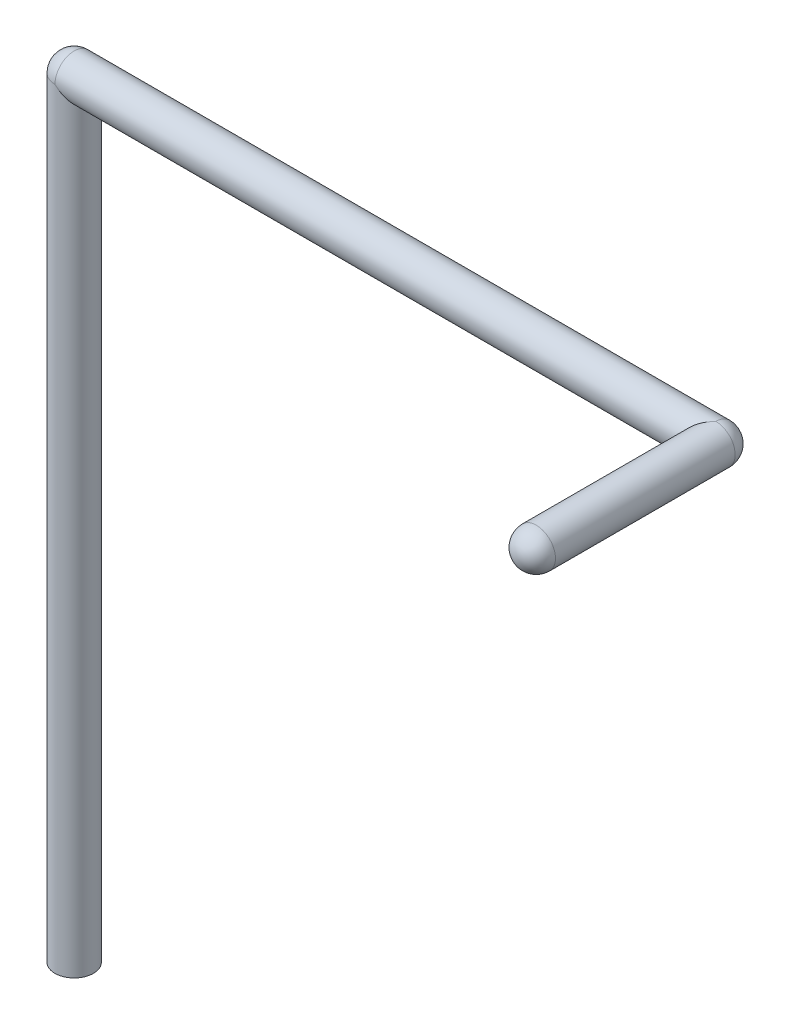
ISO-10303-21;
HEADER;
FILE_DESCRIPTION(('STEP AP214'),'2;1');
FILE_NAME('part.step','',(''),(''),'','','');
FILE_SCHEMA(('AUTOMOTIVE_DESIGN { 1 0 10303 214 1 1 1 1 }'));
ENDSEC;
DATA;
#1=APPLICATION_CONTEXT('core data for automotive mechanical design processes');
#2=APPLICATION_PROTOCOL_DEFINITION('international standard','automotive_design',2000,#1);
#3=PRODUCT_CONTEXT('',#1,'mechanical');
#4=PRODUCT('Part','Part','',(#3));
#5=PRODUCT_RELATED_PRODUCT_CATEGORY('part','',(#4));
#6=PRODUCT_DEFINITION_FORMATION('','',#4);
#7=PRODUCT_DEFINITION_CONTEXT('part definition',#1,'design');
#8=PRODUCT_DEFINITION('design','',#6,#7);
#9=PRODUCT_DEFINITION_SHAPE('','',#8);
#10=(LENGTH_UNIT() NAMED_UNIT(*) SI_UNIT(.MILLI.,.METRE.));
#11=(NAMED_UNIT(*) PLANE_ANGLE_UNIT() SI_UNIT($,.RADIAN.));
#12=(NAMED_UNIT(*) SI_UNIT($,.STERADIAN.) SOLID_ANGLE_UNIT());
#13=UNCERTAINTY_MEASURE_WITH_UNIT(LENGTH_MEASURE(1.E-05),#10,'distance_accuracy_value','');
#14=(GEOMETRIC_REPRESENTATION_CONTEXT(3) GLOBAL_UNCERTAINTY_ASSIGNED_CONTEXT((#13)) GLOBAL_UNIT_ASSIGNED_CONTEXT((#10,
#11,#12)) REPRESENTATION_CONTEXT('',''));
#15=CARTESIAN_POINT('',(0.,0.,0.));
#16=DIRECTION('',(0.,0.,1.));
#17=DIRECTION('',(1.,0.,0.));
#18=AXIS2_PLACEMENT_3D('',#15,#16,#17);
#19=CARTESIAN_POINT('',(25.,30.,0.));
#20=DIRECTION('',(-1.,0.,0.));
#21=DIRECTION('',(0.,0.,1.));
#22=AXIS2_PLACEMENT_3D('',#19,#20,#21);
#23=CYLINDRICAL_SURFACE('',#22,0.75);
#24=CARTESIAN_POINT('',(0.,30.,0.));
#25=DIRECTION('',(1.,0.,0.));
#26=DIRECTION('',(0.,0.,-1.));
#27=AXIS2_PLACEMENT_3D('',#24,#25,#26);
#28=CIRCLE('',#27,0.75);
#29=CARTESIAN_POINT('',(0.,30.,-0.75));
#30=VERTEX_POINT('',#29);
#31=CARTESIAN_POINT('',(0.,30.,0.75));
#32=VERTEX_POINT('',#31);
#33=EDGE_CURVE('E53',#30,#32,#28,.T.);
#34=ORIENTED_EDGE('',*,*,#33,.T.);
#35=CARTESIAN_POINT('',(0.,30.,0.));
#36=DIRECTION('',(-0.707106781186547,-0.707106781186547,0.));
#37=DIRECTION('',(0.707106781186547,-0.707106781186547,0.));
#38=AXIS2_PLACEMENT_3D('',#35,#36,#37);
#39=ELLIPSE('',#38,1.06066017177982,0.75);
#40=EDGE_CURVE('E63',#32,#30,#39,.F.);
#41=ORIENTED_EDGE('',*,*,#40,.T.);
#42=EDGE_LOOP('',(#34,#41));
#43=FACE_BOUND('',#42,.T.);
#44=CARTESIAN_POINT('',(25.,30.,0.));
#45=DIRECTION('',(-0.707106781186547,0.,-0.707106781186547));
#46=DIRECTION('',(-0.707106781186547,0.,0.707106781186547));
#47=AXIS2_PLACEMENT_3D('',#44,#45,#46);
#48=ELLIPSE('',#47,1.06066017177982,0.750000000000001);
#49=CARTESIAN_POINT('',(25.,30.75,0.));
#50=VERTEX_POINT('',#49);
#51=CARTESIAN_POINT('',(25.,29.25,0.));
#52=VERTEX_POINT('',#51);
#53=EDGE_CURVE('E65',#50,#52,#48,.F.);
#54=ORIENTED_EDGE('',*,*,#53,.F.);
#55=CARTESIAN_POINT('',(25.,30.,0.));
#56=DIRECTION('',(1.,0.,0.));
#57=DIRECTION('',(0.,0.,-1.));
#58=AXIS2_PLACEMENT_3D('',#55,#56,#57);
#59=CIRCLE('',#58,0.75);
#60=EDGE_CURVE('E58',#52,#50,#59,.T.);
#61=ORIENTED_EDGE('',*,*,#60,.F.);
#62=EDGE_LOOP('',(#54,#61));
#63=FACE_BOUND('',#62,.T.);
#64=ADVANCED_FACE('F34',(#43,#63),#23,.T.);
#65=CARTESIAN_POINT('',(25.,30.,0.));
#66=DIRECTION('',(-1.,0.,0.));
#67=DIRECTION('',(0.,1.,0.));
#68=AXIS2_PLACEMENT_3D('',#65,#66,#67);
#69=SPHERICAL_SURFACE('',#68,0.750000000000001);
#70=CARTESIAN_POINT('',(25.,30.,0.));
#71=DIRECTION('',(0.,0.,1.));
#72=DIRECTION('',(1.,0.,0.));
#73=AXIS2_PLACEMENT_3D('',#70,#71,#72);
#74=CIRCLE('',#73,0.750000000000001);
#75=EDGE_CURVE('E11',#52,#50,#74,.T.);
#76=ORIENTED_EDGE('',*,*,#75,.F.);
#77=ORIENTED_EDGE('',*,*,#60,.T.);
#78=EDGE_LOOP('',(#76,#77));
#79=FACE_BOUND('',#78,.T.);
#80=ADVANCED_FACE('F60',(#79),#69,.T.);
#81=CARTESIAN_POINT('',(0.,30.,0.));
#82=DIRECTION('',(0.,-1.,0.));
#83=DIRECTION('',(0.,0.,-1.));
#84=AXIS2_PLACEMENT_3D('',#81,#82,#83);
#85=CYLINDRICAL_SURFACE('',#84,0.75);
#86=CARTESIAN_POINT('',(0.,0.,0.));
#87=DIRECTION('',(0.,1.,0.));
#88=DIRECTION('',(0.,0.,1.));
#89=AXIS2_PLACEMENT_3D('',#86,#87,#88);
#90=CIRCLE('',#89,0.75);
#91=CARTESIAN_POINT('',(0.,0.,0.75));
#92=VERTEX_POINT('',#91);
#93=EDGE_CURVE('E102',#92,#92,#90,.T.);
#94=ORIENTED_EDGE('',*,*,#93,.T.);
#95=EDGE_LOOP('',(#94));
#96=FACE_BOUND('',#95,.T.);
#97=ORIENTED_EDGE('',*,*,#40,.F.);
#98=CARTESIAN_POINT('',(0.,30.,0.));
#99=DIRECTION('',(0.,1.,0.));
#100=DIRECTION('',(0.,0.,1.));
#101=AXIS2_PLACEMENT_3D('',#98,#99,#100);
#102=CIRCLE('',#101,0.75);
#103=EDGE_CURVE('E42',#30,#32,#102,.T.);
#104=ORIENTED_EDGE('',*,*,#103,.F.);
#105=EDGE_LOOP('',(#97,#104));
#106=FACE_BOUND('',#105,.T.);
#107=ADVANCED_FACE('F36',(#96,#106),#85,.T.);
#108=CARTESIAN_POINT('',(0.,30.,0.));
#109=DIRECTION('',(0.,1.,0.));
#110=DIRECTION('',(0.,0.,-1.));
#111=AXIS2_PLACEMENT_3D('',#108,#109,#110);
#112=SPHERICAL_SURFACE('',#111,0.750000000000001);
#113=ORIENTED_EDGE('',*,*,#33,.F.);
#114=ORIENTED_EDGE('',*,*,#103,.T.);
#115=EDGE_LOOP('',(#113,#114));
#116=FACE_BOUND('',#115,.T.);
#117=ADVANCED_FACE('F81',(#116),#112,.T.);
#118=CARTESIAN_POINT('',(0.,0.,0.));
#119=DIRECTION('',(0.,1.,0.));
#120=DIRECTION('',(0.,0.,1.));
#121=AXIS2_PLACEMENT_3D('',#118,#119,#120);
#122=PLANE('',#121);
#123=ORIENTED_EDGE('',*,*,#93,.F.);
#124=EDGE_LOOP('',(#123));
#125=FACE_BOUND('',#124,.T.);
#126=ADVANCED_FACE('F72',(#125),#122,.F.);
#127=CARTESIAN_POINT('',(25.,30.,7.));
#128=DIRECTION('',(0.,0.,-1.));
#129=DIRECTION('',(-1.,0.,0.));
#130=AXIS2_PLACEMENT_3D('',#127,#128,#129);
#131=CYLINDRICAL_SURFACE('',#130,0.750000000000002);
#132=CARTESIAN_POINT('',(25.,30.,7.));
#133=DIRECTION('',(0.,0.,1.));
#134=DIRECTION('',(1.,0.,0.));
#135=AXIS2_PLACEMENT_3D('',#132,#133,#134);
#136=CIRCLE('',#135,0.750000000000002);
#137=CARTESIAN_POINT('',(25.75,30.,7.));
#138=VERTEX_POINT('',#137);
#139=EDGE_CURVE('E67',#138,#138,#136,.T.);
#140=ORIENTED_EDGE('',*,*,#139,.F.);
#141=EDGE_LOOP('',(#140));
#142=FACE_BOUND('',#141,.T.);
#143=ORIENTED_EDGE('',*,*,#75,.T.);
#144=ORIENTED_EDGE('',*,*,#53,.T.);
#145=EDGE_LOOP('',(#143,#144));
#146=FACE_BOUND('',#145,.T.);
#147=ADVANCED_FACE('F69',(#142,#146),#131,.T.);
#148=CARTESIAN_POINT('',(25.,30.,7.));
#149=DIRECTION('',(0.,1.,0.));
#150=DIRECTION('',(1.,0.,0.));
#151=AXIS2_PLACEMENT_3D('',#148,#149,#150);
#152=SPHERICAL_SURFACE('',#151,0.750000000000001);
#153=CARTESIAN_POINT('',(25.,30.,7.));
#154=DIRECTION('',(0.,0.,1.));
#155=DIRECTION('',(1.,0.,0.));
#156=AXIS2_PLACEMENT_3D('',#153,#154,#155);
#157=SPHERICAL_SURFACE('',#156,0.750000000000001);
#158=ORIENTED_EDGE('',*,*,#139,.T.);
#159=EDGE_LOOP('',(#158));
#160=FACE_BOUND('',#159,.T.);
#161=ADVANCED_FACE('F71',(#160),#157,.T.);
#162=CLOSED_SHELL('',(#64,#80,#107,#117,#126,#147,#161));
#163=MANIFOLD_SOLID_BREP('B2',#162);
#164=ADVANCED_BREP_SHAPE_REPRESENTATION('',(#18,#163),#14);
#165=SHAPE_DEFINITION_REPRESENTATION(#9,#164);
ENDSEC;
END-ISO-10303-21;
